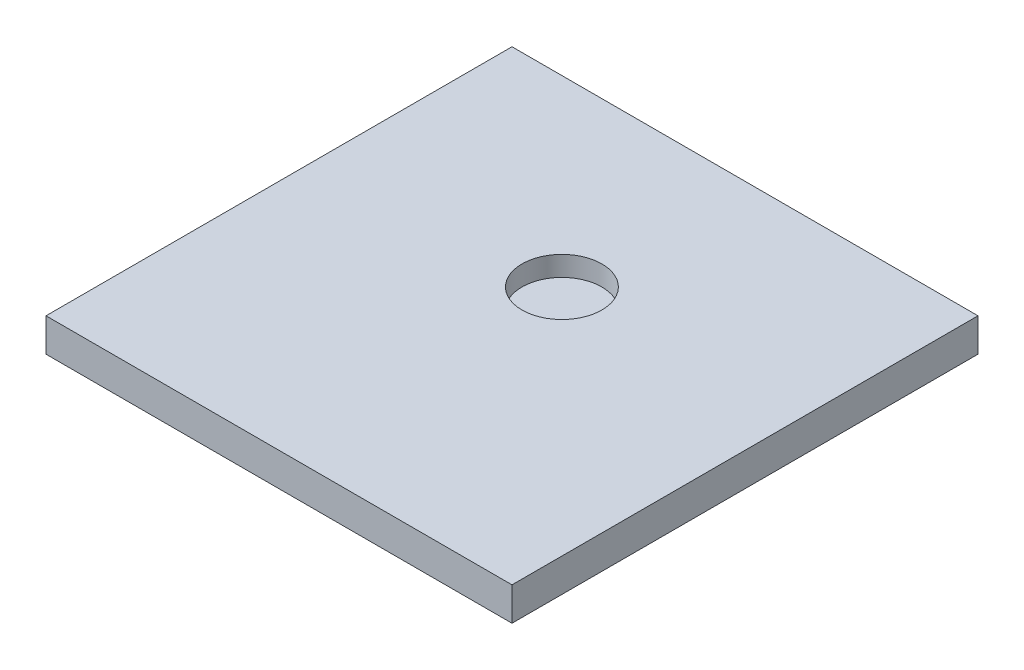
ISO-10303-21;
HEADER;
FILE_DESCRIPTION(('STEP AP214'),'2;1');
FILE_NAME('part.step','',(''),(''),'','','');
FILE_SCHEMA(('AUTOMOTIVE_DESIGN { 1 0 10303 214 1 1 1 1 }'));
ENDSEC;
DATA;
#1=APPLICATION_CONTEXT('core data for automotive mechanical design processes');
#2=APPLICATION_PROTOCOL_DEFINITION('international standard','automotive_design',2000,#1);
#3=PRODUCT_CONTEXT('',#1,'mechanical');
#4=PRODUCT('Part','Part','',(#3));
#5=PRODUCT_RELATED_PRODUCT_CATEGORY('part','',(#4));
#6=PRODUCT_DEFINITION_FORMATION('','',#4);
#7=PRODUCT_DEFINITION_CONTEXT('part definition',#1,'design');
#8=PRODUCT_DEFINITION('design','',#6,#7);
#9=PRODUCT_DEFINITION_SHAPE('','',#8);
#10=(LENGTH_UNIT() NAMED_UNIT(*) SI_UNIT(.MILLI.,.METRE.));
#11=(NAMED_UNIT(*) PLANE_ANGLE_UNIT() SI_UNIT($,.RADIAN.));
#12=(NAMED_UNIT(*) SI_UNIT($,.STERADIAN.) SOLID_ANGLE_UNIT());
#13=UNCERTAINTY_MEASURE_WITH_UNIT(LENGTH_MEASURE(1.E-05),#10,'distance_accuracy_value','');
#14=(GEOMETRIC_REPRESENTATION_CONTEXT(3) GLOBAL_UNCERTAINTY_ASSIGNED_CONTEXT((#13)) GLOBAL_UNIT_ASSIGNED_CONTEXT((#10,
#11,#12)) REPRESENTATION_CONTEXT('',''));
#15=CARTESIAN_POINT('',(0.,0.,0.));
#16=DIRECTION('',(0.,0.,1.));
#17=DIRECTION('',(1.,0.,0.));
#18=AXIS2_PLACEMENT_3D('',#15,#16,#17);
#19=CARTESIAN_POINT('',(-89.0863605492635,-12.7,-133.113132047063));
#20=DIRECTION('',(-1.,0.,0.));
#21=DIRECTION('',(0.,0.,1.));
#22=AXIS2_PLACEMENT_3D('',#19,#20,#21);
#23=PLANE('',#22);
#24=DIRECTION('',(0.,0.,1.));
#25=VECTOR('',#24,1.);
#26=CARTESIAN_POINT('',(-89.0863605492635,0.,-133.113132047063));
#27=LINE('',#26,#25);
#28=CARTESIAN_POINT('',(-89.0863605492635,0.,-133.113132047063));
#29=VERTEX_POINT('',#28);
#30=CARTESIAN_POINT('',(-89.0863605492635,0.,44.686867952937));
#31=VERTEX_POINT('',#30);
#32=EDGE_CURVE('E99',#29,#31,#27,.T.);
#33=ORIENTED_EDGE('',*,*,#32,.F.);
#34=DIRECTION('',(0.,1.,0.));
#35=VECTOR('',#34,1.);
#36=CARTESIAN_POINT('',(-89.0863605492635,-12.7,-133.113132047063));
#37=LINE('',#36,#35);
#38=CARTESIAN_POINT('',(-89.0863605492635,-12.7,-133.113132047063));
#39=VERTEX_POINT('',#38);
#40=EDGE_CURVE('E11',#39,#29,#37,.T.);
#41=ORIENTED_EDGE('',*,*,#40,.F.);
#42=DIRECTION('',(0.,0.,1.));
#43=VECTOR('',#42,1.);
#44=CARTESIAN_POINT('',(-89.0863605492635,-12.7,-133.113132047063));
#45=LINE('',#44,#43);
#46=CARTESIAN_POINT('',(-89.0863605492635,-12.7,44.686867952937));
#47=VERTEX_POINT('',#46);
#48=EDGE_CURVE('E92',#39,#47,#45,.T.);
#49=ORIENTED_EDGE('',*,*,#48,.T.);
#50=DIRECTION('',(0.,1.,0.));
#51=VECTOR('',#50,1.);
#52=CARTESIAN_POINT('',(-89.0863605492635,-12.7,44.686867952937));
#53=LINE('',#52,#51);
#54=EDGE_CURVE('E37',#47,#31,#53,.T.);
#55=ORIENTED_EDGE('',*,*,#54,.T.);
#56=EDGE_LOOP('',(#33,#41,#49,#55));
#57=FACE_BOUND('',#56,.T.);
#58=ADVANCED_FACE('F34',(#57),#23,.T.);
#59=CARTESIAN_POINT('',(-89.0863605492635,-12.7,-133.113132047063));
#60=DIRECTION('',(0.,0.,-1.));
#61=DIRECTION('',(-1.,0.,0.));
#62=AXIS2_PLACEMENT_3D('',#59,#60,#61);
#63=PLANE('',#62);
#64=DIRECTION('',(-1.,0.,0.));
#65=VECTOR('',#64,1.);
#66=CARTESIAN_POINT('',(-89.0863605492635,0.,-133.113132047063));
#67=LINE('',#66,#65);
#68=CARTESIAN_POINT('',(88.7136394507365,0.,-133.113132047063));
#69=VERTEX_POINT('',#68);
#70=EDGE_CURVE('E94',#69,#29,#67,.T.);
#71=ORIENTED_EDGE('',*,*,#70,.F.);
#72=DIRECTION('',(0.,1.,0.));
#73=VECTOR('',#72,1.);
#74=CARTESIAN_POINT('',(88.7136394507365,-12.7,-133.113132047063));
#75=LINE('',#74,#73);
#76=CARTESIAN_POINT('',(88.7136394507365,-12.7,-133.113132047063));
#77=VERTEX_POINT('',#76);
#78=EDGE_CURVE('E43',#77,#69,#75,.T.);
#79=ORIENTED_EDGE('',*,*,#78,.F.);
#80=DIRECTION('',(-1.,0.,0.));
#81=VECTOR('',#80,1.);
#82=CARTESIAN_POINT('',(-89.0863605492635,-12.7,-133.113132047063));
#83=LINE('',#82,#81);
#84=EDGE_CURVE('E89',#77,#39,#83,.T.);
#85=ORIENTED_EDGE('',*,*,#84,.T.);
#86=ORIENTED_EDGE('',*,*,#40,.T.);
#87=EDGE_LOOP('',(#71,#79,#85,#86));
#88=FACE_BOUND('',#87,.T.);
#89=ADVANCED_FACE('F110',(#88),#63,.T.);
#90=CARTESIAN_POINT('',(88.7136394507365,-12.7,-133.113132047063));
#91=DIRECTION('',(1.,0.,0.));
#92=DIRECTION('',(0.,0.,-1.));
#93=AXIS2_PLACEMENT_3D('',#90,#91,#92);
#94=PLANE('',#93);
#95=DIRECTION('',(0.,0.,-1.));
#96=VECTOR('',#95,1.);
#97=CARTESIAN_POINT('',(88.7136394507365,0.,-133.113132047063));
#98=LINE('',#97,#96);
#99=CARTESIAN_POINT('',(88.7136394507365,0.,44.686867952937));
#100=VERTEX_POINT('',#99);
#101=EDGE_CURVE('E84',#100,#69,#98,.T.);
#102=ORIENTED_EDGE('',*,*,#101,.F.);
#103=DIRECTION('',(0.,1.,0.));
#104=VECTOR('',#103,1.);
#105=CARTESIAN_POINT('',(88.7136394507365,-12.7,44.686867952937));
#106=LINE('',#105,#104);
#107=CARTESIAN_POINT('',(88.7136394507365,-12.7,44.686867952937));
#108=VERTEX_POINT('',#107);
#109=EDGE_CURVE('E79',#108,#100,#106,.T.);
#110=ORIENTED_EDGE('',*,*,#109,.F.);
#111=DIRECTION('',(0.,0.,-1.));
#112=VECTOR('',#111,1.);
#113=CARTESIAN_POINT('',(88.7136394507365,-12.7,-133.113132047063));
#114=LINE('',#113,#112);
#115=EDGE_CURVE('E82',#108,#77,#114,.T.);
#116=ORIENTED_EDGE('',*,*,#115,.T.);
#117=ORIENTED_EDGE('',*,*,#78,.T.);
#118=EDGE_LOOP('',(#102,#110,#116,#117));
#119=FACE_BOUND('',#118,.T.);
#120=ADVANCED_FACE('F81',(#119),#94,.T.);
#121=CARTESIAN_POINT('',(-89.0863605492635,-12.7,44.686867952937));
#122=DIRECTION('',(0.,0.,1.));
#123=DIRECTION('',(1.,0.,0.));
#124=AXIS2_PLACEMENT_3D('',#121,#122,#123);
#125=PLANE('',#124);
#126=DIRECTION('',(1.,0.,0.));
#127=VECTOR('',#126,1.);
#128=CARTESIAN_POINT('',(-89.0863605492635,0.,44.686867952937));
#129=LINE('',#128,#127);
#130=EDGE_CURVE('E102',#31,#100,#129,.T.);
#131=ORIENTED_EDGE('',*,*,#130,.F.);
#132=ORIENTED_EDGE('',*,*,#54,.F.);
#133=DIRECTION('',(1.,0.,0.));
#134=VECTOR('',#133,1.);
#135=CARTESIAN_POINT('',(-89.0863605492635,-12.7,44.686867952937));
#136=LINE('',#135,#134);
#137=EDGE_CURVE('E88',#47,#108,#136,.T.);
#138=ORIENTED_EDGE('',*,*,#137,.T.);
#139=ORIENTED_EDGE('',*,*,#109,.T.);
#140=EDGE_LOOP('',(#131,#132,#138,#139));
#141=FACE_BOUND('',#140,.T.);
#142=ADVANCED_FACE('F91',(#141),#125,.T.);
#143=CARTESIAN_POINT('',(0.,-12.7,0.));
#144=DIRECTION('',(0.,1.,0.));
#145=DIRECTION('',(0.,0.,1.));
#146=AXIS2_PLACEMENT_3D('',#143,#144,#145);
#147=PLANE('',#146);
#148=ORIENTED_EDGE('',*,*,#48,.F.);
#149=ORIENTED_EDGE('',*,*,#84,.F.);
#150=ORIENTED_EDGE('',*,*,#115,.F.);
#151=ORIENTED_EDGE('',*,*,#137,.F.);
#152=EDGE_LOOP('',(#148,#149,#150,#151));
#153=FACE_BOUND('',#152,.T.);
#154=ADVANCED_FACE('F87',(#153),#147,.F.);
#155=CARTESIAN_POINT('',(0.,0.,0.));
#156=DIRECTION('',(0.,1.,0.));
#157=DIRECTION('',(0.,0.,1.));
#158=AXIS2_PLACEMENT_3D('',#155,#156,#157);
#159=PLANE('',#158);
#160=CARTESIAN_POINT('',(-0.186360549263492,0.,-63.263132047063));
#161=DIRECTION('',(0.,1.,0.));
#162=DIRECTION('',(0.,0.,1.));
#163=AXIS2_PLACEMENT_3D('',#160,#161,#162);
#164=CIRCLE('',#163,15.24);
#165=CARTESIAN_POINT('',(-0.186360549263492,0.,-48.023132047063));
#166=VERTEX_POINT('',#165);
#167=EDGE_CURVE('E140',#166,#166,#164,.T.);
#168=ORIENTED_EDGE('',*,*,#167,.F.);
#169=EDGE_LOOP('',(#168));
#170=FACE_BOUND('',#169,.T.);
#171=ORIENTED_EDGE('',*,*,#32,.T.);
#172=ORIENTED_EDGE('',*,*,#130,.T.);
#173=ORIENTED_EDGE('',*,*,#101,.T.);
#174=ORIENTED_EDGE('',*,*,#70,.T.);
#175=EDGE_LOOP('',(#171,#172,#173,#174));
#176=FACE_BOUND('',#175,.T.);
#177=ADVANCED_FACE('F109',(#170,#176),#159,.T.);
#178=CARTESIAN_POINT('',(-0.186360549263492,-7.62,-63.263132047063));
#179=DIRECTION('',(0.,1.,0.));
#180=DIRECTION('',(0.,0.,1.));
#181=AXIS2_PLACEMENT_3D('',#178,#179,#180);
#182=CYLINDRICAL_SURFACE('',#181,15.24);
#183=CARTESIAN_POINT('',(-0.186360549263492,-7.62,-63.263132047063));
#184=DIRECTION('',(0.,1.,0.));
#185=DIRECTION('',(0.,0.,1.));
#186=AXIS2_PLACEMENT_3D('',#183,#184,#185);
#187=CIRCLE('',#186,15.24);
#188=CARTESIAN_POINT('',(-0.186360549263492,-7.62,-48.023132047063));
#189=VERTEX_POINT('',#188);
#190=EDGE_CURVE('E103',#189,#189,#187,.T.);
#191=CARTESIAN_POINT('',(-0.186360549263492,-7.62,-48.023132047063));
#192=CARTESIAN_POINT('',(-0.186360549263492,-7.540625,-48.023132047063));
#193=CARTESIAN_POINT('',(-0.186360549263492,-7.46125,-48.023132047063));
#194=CARTESIAN_POINT('',(-0.186360549263492,-7.3025,-48.023132047063));
#195=CARTESIAN_POINT('',(-0.186360549263492,-7.223125,-48.023132047063));
#196=CARTESIAN_POINT('',(-0.186360549263492,-7.064375,-48.023132047063));
#197=CARTESIAN_POINT('',(-0.186360549263492,-6.985,-48.023132047063));
#198=CARTESIAN_POINT('',(-0.186360549263492,-6.82625,-48.023132047063));
#199=CARTESIAN_POINT('',(-0.186360549263492,-6.746875,-48.023132047063));
#200=CARTESIAN_POINT('',(-0.186360549263492,-6.588125,-48.023132047063));
#201=CARTESIAN_POINT('',(-0.186360549263492,-6.50875,-48.023132047063));
#202=CARTESIAN_POINT('',(-0.186360549263492,-6.35,-48.023132047063));
#203=CARTESIAN_POINT('',(-0.186360549263492,-6.270625,-48.023132047063));
#204=CARTESIAN_POINT('',(-0.186360549263492,-6.111875,-48.023132047063));
#205=CARTESIAN_POINT('',(-0.186360549263492,-6.0325,-48.023132047063));
#206=CARTESIAN_POINT('',(-0.186360549263492,-5.87375,-48.023132047063));
#207=CARTESIAN_POINT('',(-0.186360549263492,-5.794375,-48.023132047063));
#208=CARTESIAN_POINT('',(-0.186360549263492,-5.635625,-48.023132047063));
#209=CARTESIAN_POINT('',(-0.186360549263492,-5.55625,-48.023132047063));
#210=CARTESIAN_POINT('',(-0.186360549263492,-5.3975,-48.023132047063));
#211=CARTESIAN_POINT('',(-0.186360549263492,-5.318125,-48.023132047063));
#212=CARTESIAN_POINT('',(-0.186360549263492,-5.159375,-48.023132047063));
#213=CARTESIAN_POINT('',(-0.186360549263492,-5.08,-48.023132047063));
#214=CARTESIAN_POINT('',(-0.186360549263492,-4.92125,-48.023132047063));
#215=CARTESIAN_POINT('',(-0.186360549263492,-4.841875,-48.023132047063));
#216=CARTESIAN_POINT('',(-0.186360549263492,-4.683125,-48.023132047063));
#217=CARTESIAN_POINT('',(-0.186360549263492,-4.60375,-48.023132047063));
#218=CARTESIAN_POINT('',(-0.186360549263492,-4.445,-48.023132047063));
#219=CARTESIAN_POINT('',(-0.186360549263492,-4.365625,-48.023132047063));
#220=CARTESIAN_POINT('',(-0.186360549263492,-4.206875,-48.023132047063));
#221=CARTESIAN_POINT('',(-0.186360549263492,-4.1275,-48.023132047063));
#222=CARTESIAN_POINT('',(-0.186360549263492,-3.96875,-48.023132047063));
#223=CARTESIAN_POINT('',(-0.186360549263492,-3.889375,-48.023132047063));
#224=CARTESIAN_POINT('',(-0.186360549263492,-3.730625,-48.023132047063));
#225=CARTESIAN_POINT('',(-0.186360549263492,-3.65125,-48.023132047063));
#226=CARTESIAN_POINT('',(-0.186360549263492,-3.4925,-48.023132047063));
#227=CARTESIAN_POINT('',(-0.186360549263492,-3.413125,-48.023132047063));
#228=CARTESIAN_POINT('',(-0.186360549263492,-3.254375,-48.023132047063));
#229=CARTESIAN_POINT('',(-0.186360549263492,-3.175,-48.023132047063));
#230=CARTESIAN_POINT('',(-0.186360549263492,-3.01625,-48.023132047063));
#231=CARTESIAN_POINT('',(-0.186360549263492,-2.936875,-48.023132047063));
#232=CARTESIAN_POINT('',(-0.186360549263492,-2.778125,-48.023132047063));
#233=CARTESIAN_POINT('',(-0.186360549263492,-2.69875,-48.023132047063));
#234=CARTESIAN_POINT('',(-0.186360549263492,-2.54,-48.023132047063));
#235=CARTESIAN_POINT('',(-0.186360549263492,-2.460625,-48.023132047063));
#236=CARTESIAN_POINT('',(-0.186360549263492,-2.301875,-48.023132047063));
#237=CARTESIAN_POINT('',(-0.186360549263492,-2.2225,-48.023132047063));
#238=CARTESIAN_POINT('',(-0.186360549263492,-2.06375,-48.023132047063));
#239=CARTESIAN_POINT('',(-0.186360549263492,-1.984375,-48.023132047063));
#240=CARTESIAN_POINT('',(-0.186360549263492,-1.825625,-48.023132047063));
#241=CARTESIAN_POINT('',(-0.186360549263492,-1.74625,-48.023132047063));
#242=CARTESIAN_POINT('',(-0.186360549263492,-1.5875,-48.023132047063));
#243=CARTESIAN_POINT('',(-0.186360549263492,-1.508125,-48.023132047063));
#244=CARTESIAN_POINT('',(-0.186360549263492,-1.349375,-48.023132047063));
#245=CARTESIAN_POINT('',(-0.186360549263492,-1.27,-48.023132047063));
#246=CARTESIAN_POINT('',(-0.186360549263492,-1.11125,-48.023132047063));
#247=CARTESIAN_POINT('',(-0.186360549263492,-1.031875,-48.023132047063));
#248=CARTESIAN_POINT('',(-0.186360549263492,-0.873125,-48.023132047063));
#249=CARTESIAN_POINT('',(-0.186360549263492,-0.79375,-48.023132047063));
#250=CARTESIAN_POINT('',(-0.186360549263492,-0.635,-48.023132047063));
#251=CARTESIAN_POINT('',(-0.186360549263492,-0.555625,-48.023132047063));
#252=CARTESIAN_POINT('',(-0.186360549263492,-0.396875,-48.023132047063));
#253=CARTESIAN_POINT('',(-0.186360549263492,-0.3175,-48.023132047063));
#254=CARTESIAN_POINT('',(-0.186360549263492,-0.15875,-48.023132047063));
#255=CARTESIAN_POINT('',(-0.186360549263492,-0.0793749999999999,-48.023132047063));
#256=CARTESIAN_POINT('',(-0.186360549263492,0.,-48.023132047063));
#257=B_SPLINE_CURVE_WITH_KNOTS('',3,(#191,#192,#193,#194,#195,#196,#197,#198,#199,#200,#201,
#202,#203,#204,#205,#206,#207,#208,#209,#210,#211,#212,#213,#214,#215,#216,#217,#218,#219,#220,
#221,#222,#223,#224,#225,#226,#227,#228,#229,#230,#231,#232,#233,#234,#235,#236,#237,#238,#239,
#240,#241,#242,#243,#244,#245,#246,#247,#248,#249,#250,#251,#252,#253,#254,#255,#256),
.UNSPECIFIED.,.F.,.F.,(4,2,2,2,2,2,2,2,2,2,2,2,2,2,2,2,2,2,2,2,2,2,2,2,2,2,2,2,2,2,2,2,4),(0.,
0.238125,0.47625,0.714375000000001,0.9525,1.190625,1.42875,1.666875,1.905,2.143125,2.38125,
2.619375,2.8575,3.095625,3.33375,3.571875,3.81,4.048125,4.28625,4.524375,4.7625,5.000625,
5.23875,5.476875,5.715,5.953125,6.19125,6.429375,6.6675,6.905625,7.14375,7.381875,7.62),.UNSPECIFIED.);
#258=EDGE_CURVE('BSEAM127',#189,#166,#257,.T.);
#259=ORIENTED_EDGE('',*,*,#190,.F.);
#260=ORIENTED_EDGE('',*,*,#167,.T.);
#261=ORIENTED_EDGE('',*,*,#258,.T.);
#262=ORIENTED_EDGE('',*,*,#258,.F.);
#263=EDGE_LOOP('',(#259,#261,#260,#262));
#264=FACE_BOUND('',#263,.T.);
#265=ADVANCED_FACE('F127',(#264),#182,.F.);
#266=CARTESIAN_POINT('',(-0.186360549263492,-7.62,-63.263132047063));
#267=DIRECTION('',(0.,1.,0.));
#268=DIRECTION('',(0.,0.,1.));
#269=AXIS2_PLACEMENT_3D('',#266,#267,#268);
#270=PLANE('',#269);
#271=ORIENTED_EDGE('',*,*,#190,.T.);
#272=EDGE_LOOP('',(#271));
#273=FACE_BOUND('',#272,.T.);
#274=ADVANCED_FACE('F132',(#273),#270,.T.);
#275=CLOSED_SHELL('',(#58,#89,#120,#142,#154,#177,#265,#274));
#276=MANIFOLD_SOLID_BREP('B2',#275);
#277=ADVANCED_BREP_SHAPE_REPRESENTATION('',(#18,#276),#14);
#278=SHAPE_DEFINITION_REPRESENTATION(#9,#277);
ENDSEC;
END-ISO-10303-21;
